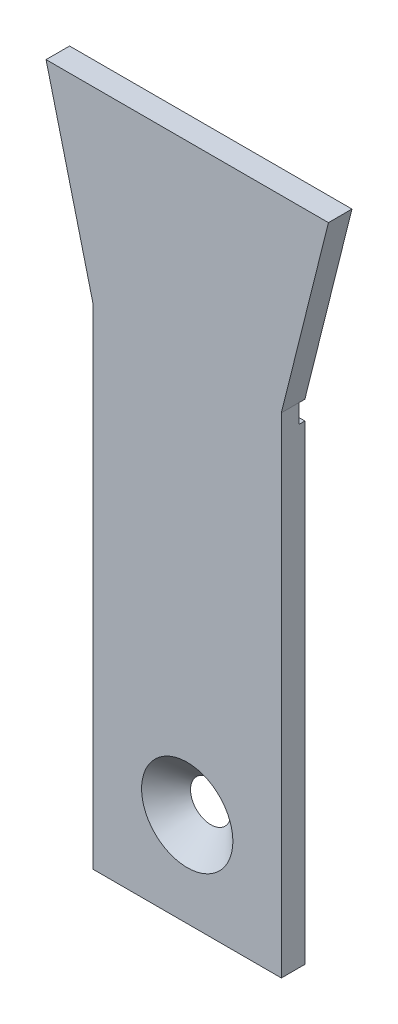
ISO-10303-21;
HEADER;
FILE_DESCRIPTION(('STEP AP214'),'2;1');
FILE_NAME('part.step','',(''),(''),'','','');
FILE_SCHEMA(('AUTOMOTIVE_DESIGN { 1 0 10303 214 1 1 1 1 }'));
ENDSEC;
DATA;
#1=APPLICATION_CONTEXT('core data for automotive mechanical design processes');
#2=APPLICATION_PROTOCOL_DEFINITION('international standard','automotive_design',2000,#1);
#3=PRODUCT_CONTEXT('',#1,'mechanical');
#4=PRODUCT('Part','Part','',(#3));
#5=PRODUCT_RELATED_PRODUCT_CATEGORY('part','',(#4));
#6=PRODUCT_DEFINITION_FORMATION('','',#4);
#7=PRODUCT_DEFINITION_CONTEXT('part definition',#1,'design');
#8=PRODUCT_DEFINITION('design','',#6,#7);
#9=PRODUCT_DEFINITION_SHAPE('','',#8);
#10=(LENGTH_UNIT() NAMED_UNIT(*) SI_UNIT(.MILLI.,.METRE.));
#11=(NAMED_UNIT(*) PLANE_ANGLE_UNIT() SI_UNIT($,.RADIAN.));
#12=(NAMED_UNIT(*) SI_UNIT($,.STERADIAN.) SOLID_ANGLE_UNIT());
#13=UNCERTAINTY_MEASURE_WITH_UNIT(LENGTH_MEASURE(1.E-05),#10,'distance_accuracy_value','');
#14=(GEOMETRIC_REPRESENTATION_CONTEXT(3) GLOBAL_UNCERTAINTY_ASSIGNED_CONTEXT((#13)) GLOBAL_UNIT_ASSIGNED_CONTEXT((#10,
#11,#12)) REPRESENTATION_CONTEXT('',''));
#15=CARTESIAN_POINT('',(0.,0.,0.));
#16=DIRECTION('',(0.,0.,1.));
#17=DIRECTION('',(1.,0.,0.));
#18=AXIS2_PLACEMENT_3D('',#15,#16,#17);
#19=CARTESIAN_POINT('',(10.,50.,2.5));
#20=DIRECTION('',(-1.,0.,0.));
#21=DIRECTION('',(0.,-1.,0.));
#22=AXIS2_PLACEMENT_3D('',#19,#20,#21);
#23=PLANE('',#22);
#24=DIRECTION('',(0.,0.,-1.));
#25=VECTOR('',#24,1.);
#26=CARTESIAN_POINT('',(10.,50.,0.6));
#27=LINE('',#26,#25);
#28=CARTESIAN_POINT('',(10.,50.,0.6));
#29=VERTEX_POINT('',#28);
#30=CARTESIAN_POINT('',(10.,50.,0.));
#31=VERTEX_POINT('',#30);
#32=EDGE_CURVE('E190',#29,#31,#27,.T.);
#33=ORIENTED_EDGE('',*,*,#32,.F.);
#34=DIRECTION('',(0.,1.,0.));
#35=VECTOR('',#34,1.);
#36=CARTESIAN_POINT('',(10.,52.,0.6));
#37=LINE('',#36,#35);
#38=CARTESIAN_POINT('',(10.,52.,0.6));
#39=VERTEX_POINT('',#38);
#40=EDGE_CURVE('E209',#29,#39,#37,.T.);
#41=ORIENTED_EDGE('',*,*,#40,.T.);
#42=DIRECTION('',(0.,0.,-1.));
#43=VECTOR('',#42,1.);
#44=CARTESIAN_POINT('',(9.99999999999999,52.,2.5));
#45=LINE('',#44,#43);
#46=CARTESIAN_POINT('',(9.99999999999999,52.,2.5));
#47=VERTEX_POINT('',#46);
#48=EDGE_CURVE('E128',#47,#39,#45,.T.);
#49=ORIENTED_EDGE('',*,*,#48,.F.);
#50=DIRECTION('',(0.,1.,0.));
#51=VECTOR('',#50,1.);
#52=CARTESIAN_POINT('',(10.,0.,2.5));
#53=LINE('',#52,#51);
#54=CARTESIAN_POINT('',(10.,0.,2.5));
#55=VERTEX_POINT('',#54);
#56=EDGE_CURVE('E116',#55,#47,#53,.T.);
#57=ORIENTED_EDGE('',*,*,#56,.F.);
#58=DIRECTION('',(0.,0.,-1.));
#59=VECTOR('',#58,1.);
#60=CARTESIAN_POINT('',(10.,0.,2.5));
#61=LINE('',#60,#59);
#62=CARTESIAN_POINT('',(10.,0.,0.));
#63=VERTEX_POINT('',#62);
#64=EDGE_CURVE('E167',#55,#63,#61,.T.);
#65=ORIENTED_EDGE('',*,*,#64,.T.);
#66=DIRECTION('',(0.,1.,0.));
#67=VECTOR('',#66,1.);
#68=CARTESIAN_POINT('',(10.,50.,0.));
#69=LINE('',#68,#67);
#70=EDGE_CURVE('E145',#63,#31,#69,.T.);
#71=ORIENTED_EDGE('',*,*,#70,.T.);
#72=EDGE_LOOP('',(#33,#41,#49,#57,#65,#71));
#73=FACE_BOUND('',#72,.T.);
#74=ADVANCED_FACE('F41',(#73),#23,.F.);
#75=CARTESIAN_POINT('',(-9.99999999999999,52.,2.5));
#76=DIRECTION('',(1.,0.,0.));
#77=DIRECTION('',(0.,1.,0.));
#78=AXIS2_PLACEMENT_3D('',#75,#76,#77);
#79=PLANE('',#78);
#80=DIRECTION('',(0.,0.,-1.));
#81=VECTOR('',#80,1.);
#82=CARTESIAN_POINT('',(-9.99999999999999,50.,0.6));
#83=LINE('',#82,#81);
#84=CARTESIAN_POINT('',(-9.99999999999999,50.,0.6));
#85=VERTEX_POINT('',#84);
#86=CARTESIAN_POINT('',(-9.99999999999999,50.,0.));
#87=VERTEX_POINT('',#86);
#88=EDGE_CURVE('E146',#85,#87,#83,.T.);
#89=ORIENTED_EDGE('',*,*,#88,.T.);
#90=DIRECTION('',(0.,-1.,0.));
#91=VECTOR('',#90,1.);
#92=CARTESIAN_POINT('',(-9.99999999999999,52.,0.));
#93=LINE('',#92,#91);
#94=CARTESIAN_POINT('',(-10.,0.,0.));
#95=VERTEX_POINT('',#94);
#96=EDGE_CURVE('E158',#87,#95,#93,.T.);
#97=ORIENTED_EDGE('',*,*,#96,.T.);
#98=DIRECTION('',(0.,0.,-1.));
#99=VECTOR('',#98,1.);
#100=CARTESIAN_POINT('',(-10.,0.,2.5));
#101=LINE('',#100,#99);
#102=CARTESIAN_POINT('',(-10.,0.,2.5));
#103=VERTEX_POINT('',#102);
#104=EDGE_CURVE('E52',#103,#95,#101,.T.);
#105=ORIENTED_EDGE('',*,*,#104,.F.);
#106=DIRECTION('',(0.,-1.,0.));
#107=VECTOR('',#106,1.);
#108=CARTESIAN_POINT('',(-10.,50.,2.5));
#109=LINE('',#108,#107);
#110=CARTESIAN_POINT('',(-9.99999999999999,52.,2.5));
#111=VERTEX_POINT('',#110);
#112=EDGE_CURVE('E60',#111,#103,#109,.T.);
#113=ORIENTED_EDGE('',*,*,#112,.F.);
#114=DIRECTION('',(0.,0.,-1.));
#115=VECTOR('',#114,1.);
#116=CARTESIAN_POINT('',(-9.99999999999999,52.,2.5));
#117=LINE('',#116,#115);
#118=CARTESIAN_POINT('',(-9.99999999999999,52.,0.6));
#119=VERTEX_POINT('',#118);
#120=EDGE_CURVE('E137',#111,#119,#117,.T.);
#121=ORIENTED_EDGE('',*,*,#120,.T.);
#122=DIRECTION('',(0.,-1.,0.));
#123=VECTOR('',#122,1.);
#124=CARTESIAN_POINT('',(-9.99999999999999,52.,0.6));
#125=LINE('',#124,#123);
#126=EDGE_CURVE('E208',#119,#85,#125,.T.);
#127=ORIENTED_EDGE('',*,*,#126,.T.);
#128=EDGE_LOOP('',(#89,#97,#105,#113,#121,#127));
#129=FACE_BOUND('',#128,.T.);
#130=ADVANCED_FACE('F174',(#129),#79,.F.);
#131=CARTESIAN_POINT('',(0.,0.,0.));
#132=DIRECTION('',(0.,0.,1.));
#133=DIRECTION('',(1.,0.,0.));
#134=AXIS2_PLACEMENT_3D('',#131,#132,#133);
#135=PLANE('',#134);
#136=CARTESIAN_POINT('',(0.,10.,0.));
#137=DIRECTION('',(0.,0.,1.));
#138=DIRECTION('',(1.,0.,0.));
#139=AXIS2_PLACEMENT_3D('',#136,#137,#138);
#140=CIRCLE('',#139,2.15);
#141=CARTESIAN_POINT('',(2.15,10.,0.));
#142=VERTEX_POINT('',#141);
#143=EDGE_CURVE('E222',#142,#142,#140,.T.);
#144=ORIENTED_EDGE('',*,*,#143,.T.);
#145=EDGE_LOOP('',(#144));
#146=FACE_BOUND('',#145,.T.);
#147=DIRECTION('',(1.,0.,0.));
#148=VECTOR('',#147,1.);
#149=CARTESIAN_POINT('',(-9.99999999999999,50.,0.));
#150=LINE('',#149,#148);
#151=EDGE_CURVE('E184',#87,#31,#150,.T.);
#152=ORIENTED_EDGE('',*,*,#151,.T.);
#153=ORIENTED_EDGE('',*,*,#70,.F.);
#154=DIRECTION('',(1.,0.,0.));
#155=VECTOR('',#154,1.);
#156=CARTESIAN_POINT('',(-10.,0.,0.));
#157=LINE('',#156,#155);
#158=EDGE_CURVE('E141',#95,#63,#157,.T.);
#159=ORIENTED_EDGE('',*,*,#158,.F.);
#160=ORIENTED_EDGE('',*,*,#96,.F.);
#161=EDGE_LOOP('',(#152,#153,#159,#160));
#162=FACE_BOUND('',#161,.T.);
#163=ADVANCED_FACE('F181',(#146,#162),#135,.F.);
#164=DIRECTION('',(-1.,0.,0.));
#165=VECTOR('',#164,1.);
#166=CARTESIAN_POINT('',(-9.99999999999999,52.,0.));
#167=LINE('',#166,#165);
#168=CARTESIAN_POINT('',(10.,52.,0.));
#169=VERTEX_POINT('',#168);
#170=CARTESIAN_POINT('',(-9.99999999999999,52.,0.));
#171=VERTEX_POINT('',#170);
#172=EDGE_CURVE('E217',#169,#171,#167,.T.);
#173=ORIENTED_EDGE('',*,*,#172,.T.);
#174=DIRECTION('',(0.242535625036333,-0.970142500145332,0.));
#175=VECTOR('',#174,1.);
#176=CARTESIAN_POINT('',(-15.,72.,0.));
#177=LINE('',#176,#175);
#178=CARTESIAN_POINT('',(-15.,72.,0.));
#179=VERTEX_POINT('',#178);
#180=EDGE_CURVE('E154',#179,#171,#177,.T.);
#181=ORIENTED_EDGE('',*,*,#180,.F.);
#182=DIRECTION('',(-1.,0.,0.));
#183=VECTOR('',#182,1.);
#184=CARTESIAN_POINT('',(15.,72.,0.));
#185=LINE('',#184,#183);
#186=CARTESIAN_POINT('',(15.,72.,0.));
#187=VERTEX_POINT('',#186);
#188=EDGE_CURVE('E82',#187,#179,#185,.T.);
#189=ORIENTED_EDGE('',*,*,#188,.F.);
#190=DIRECTION('',(0.242535625036333,0.970142500145332,0.));
#191=VECTOR('',#190,1.);
#192=CARTESIAN_POINT('',(9.99999999999999,52.,0.));
#193=LINE('',#192,#191);
#194=EDGE_CURVE('E126',#169,#187,#193,.T.);
#195=ORIENTED_EDGE('',*,*,#194,.F.);
#196=EDGE_LOOP('',(#173,#181,#189,#195));
#197=FACE_BOUND('',#196,.T.);
#198=ADVANCED_FACE('F243',(#197),#135,.F.);
#199=CARTESIAN_POINT('',(-10.,0.,2.5));
#200=DIRECTION('',(0.,1.,0.));
#201=DIRECTION('',(-1.,0.,0.));
#202=AXIS2_PLACEMENT_3D('',#199,#200,#201);
#203=PLANE('',#202);
#204=ORIENTED_EDGE('',*,*,#158,.T.);
#205=ORIENTED_EDGE('',*,*,#64,.F.);
#206=DIRECTION('',(1.,0.,0.));
#207=VECTOR('',#206,1.);
#208=CARTESIAN_POINT('',(-10.,0.,2.5));
#209=LINE('',#208,#207);
#210=EDGE_CURVE('E99',#103,#55,#209,.T.);
#211=ORIENTED_EDGE('',*,*,#210,.F.);
#212=ORIENTED_EDGE('',*,*,#104,.T.);
#213=EDGE_LOOP('',(#204,#205,#211,#212));
#214=FACE_BOUND('',#213,.T.);
#215=ADVANCED_FACE('F171',(#214),#203,.F.);
#216=CARTESIAN_POINT('',(9.99999999999999,52.,2.5));
#217=DIRECTION('',(-0.970142500145332,0.242535625036333,0.));
#218=DIRECTION('',(-0.242535625036333,-0.970142500145332,0.));
#219=AXIS2_PLACEMENT_3D('',#216,#217,#218);
#220=PLANE('',#219);
#221=ORIENTED_EDGE('',*,*,#194,.T.);
#222=DIRECTION('',(0.,0.,-1.));
#223=VECTOR('',#222,1.);
#224=CARTESIAN_POINT('',(15.,72.,2.5));
#225=LINE('',#224,#223);
#226=CARTESIAN_POINT('',(15.,72.,2.5));
#227=VERTEX_POINT('',#226);
#228=EDGE_CURVE('E122',#227,#187,#225,.T.);
#229=ORIENTED_EDGE('',*,*,#228,.F.);
#230=DIRECTION('',(0.242535625036333,0.970142500145332,0.));
#231=VECTOR('',#230,1.);
#232=CARTESIAN_POINT('',(9.99999999999999,52.,2.5));
#233=LINE('',#232,#231);
#234=EDGE_CURVE('E110',#47,#227,#233,.T.);
#235=ORIENTED_EDGE('',*,*,#234,.F.);
#236=ORIENTED_EDGE('',*,*,#48,.T.);
#237=DIRECTION('',(0.,0.,-1.));
#238=VECTOR('',#237,1.);
#239=CARTESIAN_POINT('',(10.,52.,0.6));
#240=LINE('',#239,#238);
#241=EDGE_CURVE('E233',#39,#169,#240,.T.);
#242=ORIENTED_EDGE('',*,*,#241,.T.);
#243=EDGE_LOOP('',(#221,#229,#235,#236,#242));
#244=FACE_BOUND('',#243,.T.);
#245=ADVANCED_FACE('F123',(#244),#220,.F.);
#246=CARTESIAN_POINT('',(15.,72.,2.5));
#247=DIRECTION('',(0.,-1.,0.));
#248=DIRECTION('',(0.,0.,-1.));
#249=AXIS2_PLACEMENT_3D('',#246,#247,#248);
#250=PLANE('',#249);
#251=ORIENTED_EDGE('',*,*,#188,.T.);
#252=DIRECTION('',(0.,0.,-1.));
#253=VECTOR('',#252,1.);
#254=CARTESIAN_POINT('',(-15.,72.,2.5));
#255=LINE('',#254,#253);
#256=CARTESIAN_POINT('',(-15.,72.,2.5));
#257=VERTEX_POINT('',#256);
#258=EDGE_CURVE('E129',#257,#179,#255,.T.);
#259=ORIENTED_EDGE('',*,*,#258,.F.);
#260=DIRECTION('',(-1.,0.,0.));
#261=VECTOR('',#260,1.);
#262=CARTESIAN_POINT('',(15.,72.,2.5));
#263=LINE('',#262,#261);
#264=EDGE_CURVE('E114',#227,#257,#263,.T.);
#265=ORIENTED_EDGE('',*,*,#264,.F.);
#266=ORIENTED_EDGE('',*,*,#228,.T.);
#267=EDGE_LOOP('',(#251,#259,#265,#266));
#268=FACE_BOUND('',#267,.T.);
#269=ADVANCED_FACE('F131',(#268),#250,.F.);
#270=CARTESIAN_POINT('',(-15.,72.,2.5));
#271=DIRECTION('',(0.970142500145332,0.242535625036333,0.));
#272=DIRECTION('',(-0.242535625036333,0.970142500145332,0.));
#273=AXIS2_PLACEMENT_3D('',#270,#271,#272);
#274=PLANE('',#273);
#275=ORIENTED_EDGE('',*,*,#180,.T.);
#276=DIRECTION('',(0.,0.,-1.));
#277=VECTOR('',#276,1.);
#278=CARTESIAN_POINT('',(-9.99999999999999,52.,0.6));
#279=LINE('',#278,#277);
#280=EDGE_CURVE('E90',#119,#171,#279,.T.);
#281=ORIENTED_EDGE('',*,*,#280,.F.);
#282=ORIENTED_EDGE('',*,*,#120,.F.);
#283=DIRECTION('',(0.242535625036333,-0.970142500145332,0.));
#284=VECTOR('',#283,1.);
#285=CARTESIAN_POINT('',(-15.,72.,2.5));
#286=LINE('',#285,#284);
#287=EDGE_CURVE('E134',#257,#111,#286,.T.);
#288=ORIENTED_EDGE('',*,*,#287,.F.);
#289=ORIENTED_EDGE('',*,*,#258,.T.);
#290=EDGE_LOOP('',(#275,#281,#282,#288,#289));
#291=FACE_BOUND('',#290,.T.);
#292=ADVANCED_FACE('F246',(#291),#274,.F.);
#293=CARTESIAN_POINT('',(0.,0.,2.5));
#294=DIRECTION('',(0.,0.,1.));
#295=DIRECTION('',(1.,0.,0.));
#296=AXIS2_PLACEMENT_3D('',#293,#294,#295);
#297=PLANE('',#296);
#298=CARTESIAN_POINT('',(0.,10.,2.5));
#299=DIRECTION('',(0.,0.,1.));
#300=DIRECTION('',(1.,0.,0.));
#301=AXIS2_PLACEMENT_3D('',#298,#299,#300);
#302=CIRCLE('',#301,4.85000000000002);
#303=CARTESIAN_POINT('',(4.85000000000002,10.,2.5));
#304=VERTEX_POINT('',#303);
#305=EDGE_CURVE('E11',#304,#304,#302,.F.);
#306=ORIENTED_EDGE('',*,*,#305,.T.);
#307=EDGE_LOOP('',(#306));
#308=FACE_BOUND('',#307,.T.);
#309=ORIENTED_EDGE('',*,*,#112,.T.);
#310=ORIENTED_EDGE('',*,*,#210,.T.);
#311=ORIENTED_EDGE('',*,*,#56,.T.);
#312=ORIENTED_EDGE('',*,*,#234,.T.);
#313=ORIENTED_EDGE('',*,*,#264,.T.);
#314=ORIENTED_EDGE('',*,*,#287,.T.);
#315=EDGE_LOOP('',(#309,#310,#311,#312,#313,#314));
#316=FACE_BOUND('',#315,.T.);
#317=ADVANCED_FACE('F112',(#308,#316),#297,.T.);
#318=CARTESIAN_POINT('',(-9.99999999999999,50.,0.6));
#319=DIRECTION('',(0.,1.,0.));
#320=DIRECTION('',(0.,0.,1.));
#321=AXIS2_PLACEMENT_3D('',#318,#319,#320);
#322=PLANE('',#321);
#323=ORIENTED_EDGE('',*,*,#151,.F.);
#324=ORIENTED_EDGE('',*,*,#88,.F.);
#325=DIRECTION('',(1.,0.,0.));
#326=VECTOR('',#325,1.);
#327=CARTESIAN_POINT('',(-9.99999999999999,50.,0.6));
#328=LINE('',#327,#326);
#329=EDGE_CURVE('E205',#85,#29,#328,.T.);
#330=ORIENTED_EDGE('',*,*,#329,.T.);
#331=ORIENTED_EDGE('',*,*,#32,.T.);
#332=EDGE_LOOP('',(#323,#324,#330,#331));
#333=FACE_BOUND('',#332,.T.);
#334=ADVANCED_FACE('F212',(#333),#322,.T.);
#335=CARTESIAN_POINT('',(-9.99999999999999,52.,0.6));
#336=DIRECTION('',(0.,-1.,0.));
#337=DIRECTION('',(0.,0.,-1.));
#338=AXIS2_PLACEMENT_3D('',#335,#336,#337);
#339=PLANE('',#338);
#340=ORIENTED_EDGE('',*,*,#172,.F.);
#341=ORIENTED_EDGE('',*,*,#241,.F.);
#342=DIRECTION('',(-1.,0.,0.));
#343=VECTOR('',#342,1.);
#344=CARTESIAN_POINT('',(-9.99999999999999,52.,0.6));
#345=LINE('',#344,#343);
#346=EDGE_CURVE('E226',#39,#119,#345,.T.);
#347=ORIENTED_EDGE('',*,*,#346,.T.);
#348=ORIENTED_EDGE('',*,*,#280,.T.);
#349=EDGE_LOOP('',(#340,#341,#347,#348));
#350=FACE_BOUND('',#349,.T.);
#351=ADVANCED_FACE('F276',(#350),#339,.T.);
#352=CARTESIAN_POINT('',(0.,0.,0.6));
#353=DIRECTION('',(0.,0.,1.));
#354=DIRECTION('',(1.,0.,0.));
#355=AXIS2_PLACEMENT_3D('',#352,#353,#354);
#356=PLANE('',#355);
#357=ORIENTED_EDGE('',*,*,#126,.F.);
#358=ORIENTED_EDGE('',*,*,#346,.F.);
#359=ORIENTED_EDGE('',*,*,#40,.F.);
#360=ORIENTED_EDGE('',*,*,#329,.F.);
#361=EDGE_LOOP('',(#357,#358,#359,#360));
#362=FACE_BOUND('',#361,.T.);
#363=ADVANCED_FACE('F206',(#362),#356,.F.);
#364=CARTESIAN_POINT('',(0.,10.,0.));
#365=DIRECTION('',(0.,0.,1.));
#366=DIRECTION('',(1.,0.,0.));
#367=AXIS2_PLACEMENT_3D('',#364,#365,#366);
#368=CONICAL_SURFACE('',#367,2.15,0.823840753418636);
#369=ORIENTED_EDGE('',*,*,#305,.F.);
#370=EDGE_LOOP('',(#369));
#371=FACE_BOUND('',#370,.T.);
#372=ORIENTED_EDGE('',*,*,#143,.F.);
#373=EDGE_LOOP('',(#372));
#374=FACE_BOUND('',#373,.T.);
#375=ADVANCED_FACE('F44',(#371,#374),#368,.F.);
#376=CLOSED_SHELL('',(#74,#130,#163,#198,#215,#245,#269,#292,#317,#334,#351,#363,#375));
#377=MANIFOLD_SOLID_BREP('B2',#376);
#378=ADVANCED_BREP_SHAPE_REPRESENTATION('',(#18,#377),#14);
#379=SHAPE_DEFINITION_REPRESENTATION(#9,#378);
ENDSEC;
END-ISO-10303-21;
